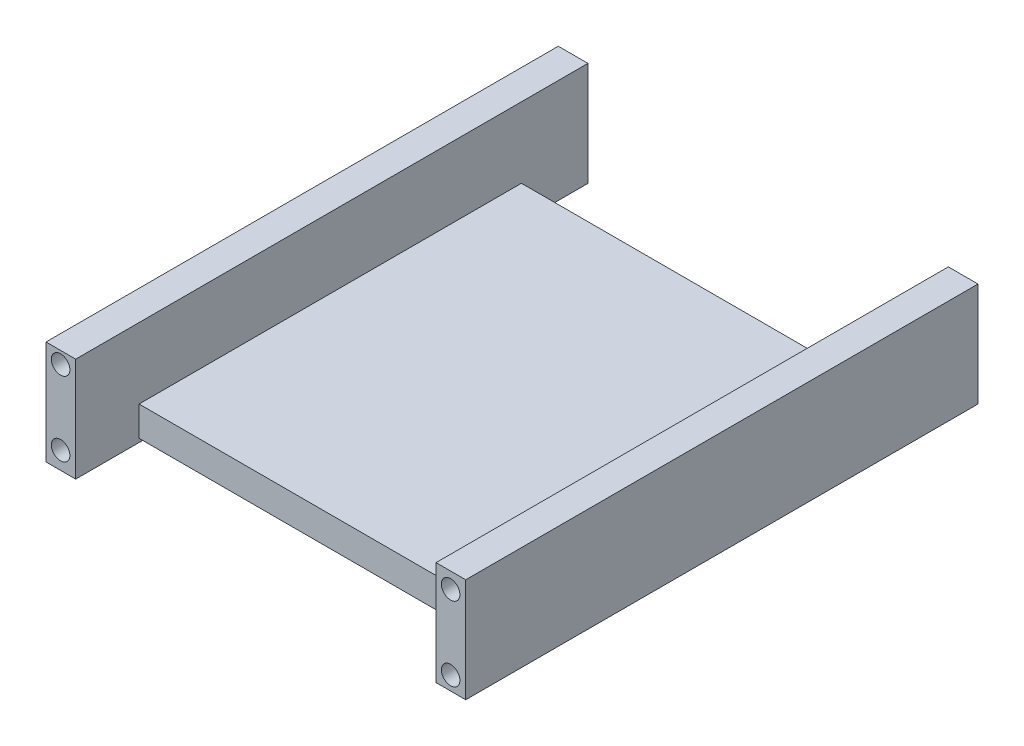
ISO-10303-21;
HEADER;
FILE_DESCRIPTION(('STEP AP214'),'2;1');
FILE_NAME('part.step','',(''),(''),'','','');
FILE_SCHEMA(('AUTOMOTIVE_DESIGN { 1 0 10303 214 1 1 1 1 }'));
ENDSEC;
DATA;
#1=APPLICATION_CONTEXT('core data for automotive mechanical design processes');
#2=APPLICATION_PROTOCOL_DEFINITION('international standard','automotive_design',2000,#1);
#3=PRODUCT_CONTEXT('',#1,'mechanical');
#4=PRODUCT('Part','Part','',(#3));
#5=PRODUCT_RELATED_PRODUCT_CATEGORY('part','',(#4));
#6=PRODUCT_DEFINITION_FORMATION('','',#4);
#7=PRODUCT_DEFINITION_CONTEXT('part definition',#1,'design');
#8=PRODUCT_DEFINITION('design','',#6,#7);
#9=PRODUCT_DEFINITION_SHAPE('','',#8);
#10=(LENGTH_UNIT() NAMED_UNIT(*) SI_UNIT(.MILLI.,.METRE.));
#11=(NAMED_UNIT(*) PLANE_ANGLE_UNIT() SI_UNIT($,.RADIAN.));
#12=(NAMED_UNIT(*) SI_UNIT($,.STERADIAN.) SOLID_ANGLE_UNIT());
#13=UNCERTAINTY_MEASURE_WITH_UNIT(LENGTH_MEASURE(1.E-05),#10,'distance_accuracy_value','');
#14=(GEOMETRIC_REPRESENTATION_CONTEXT(3) GLOBAL_UNCERTAINTY_ASSIGNED_CONTEXT((#13)) GLOBAL_UNIT_ASSIGNED_CONTEXT((#10,
#11,#12)) REPRESENTATION_CONTEXT('',''));
#15=CARTESIAN_POINT('',(0.,0.,0.));
#16=DIRECTION('',(0.,0.,1.));
#17=DIRECTION('',(1.,0.,0.));
#18=AXIS2_PLACEMENT_3D('',#15,#16,#17);
#19=CARTESIAN_POINT('',(0.,0.,0.));
#20=DIRECTION('',(1.,0.,0.));
#21=DIRECTION('',(0.,0.,-1.));
#22=AXIS2_PLACEMENT_3D('',#19,#20,#21);
#23=PLANE('',#22);
#24=DIRECTION('',(0.,-1.,0.));
#25=VECTOR('',#24,1.);
#26=CARTESIAN_POINT('',(0.,-6.,-51.));
#27=LINE('',#26,#25);
#28=CARTESIAN_POINT('',(0.,-6.,-51.));
#29=VERTEX_POINT('',#28);
#30=CARTESIAN_POINT('',(0.,-14.,-51.));
#31=VERTEX_POINT('',#30);
#32=EDGE_CURVE('E51',#29,#31,#27,.T.);
#33=ORIENTED_EDGE('',*,*,#32,.F.);
#34=DIRECTION('',(0.,0.,-1.));
#35=VECTOR('',#34,1.);
#36=CARTESIAN_POINT('',(0.,-6.,-51.));
#37=LINE('',#36,#35);
#38=CARTESIAN_POINT('',(0.,-6.,52.));
#39=VERTEX_POINT('',#38);
#40=EDGE_CURVE('E160',#39,#29,#37,.T.);
#41=ORIENTED_EDGE('',*,*,#40,.F.);
#42=DIRECTION('',(0.,1.,0.));
#43=VECTOR('',#42,1.);
#44=CARTESIAN_POINT('',(0.,-6.,52.));
#45=LINE('',#44,#43);
#46=CARTESIAN_POINT('',(0.,-14.,52.));
#47=VERTEX_POINT('',#46);
#48=EDGE_CURVE('E150',#47,#39,#45,.T.);
#49=ORIENTED_EDGE('',*,*,#48,.F.);
#50=DIRECTION('',(0.,0.,-1.));
#51=VECTOR('',#50,1.);
#52=CARTESIAN_POINT('',(0.,-14.,69.));
#53=LINE('',#52,#51);
#54=CARTESIAN_POINT('',(0.,-14.,69.));
#55=VERTEX_POINT('',#54);
#56=EDGE_CURVE('E289',#55,#47,#53,.T.);
#57=ORIENTED_EDGE('',*,*,#56,.F.);
#58=DIRECTION('',(0.,-1.,0.));
#59=VECTOR('',#58,1.);
#60=CARTESIAN_POINT('',(0.,14.,69.));
#61=LINE('',#60,#59);
#62=CARTESIAN_POINT('',(0.,14.,69.));
#63=VERTEX_POINT('',#62);
#64=EDGE_CURVE('E278',#63,#55,#61,.T.);
#65=ORIENTED_EDGE('',*,*,#64,.F.);
#66=DIRECTION('',(0.,0.,1.));
#67=VECTOR('',#66,1.);
#68=CARTESIAN_POINT('',(0.,14.,69.));
#69=LINE('',#68,#67);
#70=CARTESIAN_POINT('',(0.,14.,-69.));
#71=VERTEX_POINT('',#70);
#72=EDGE_CURVE('E272',#71,#63,#69,.T.);
#73=ORIENTED_EDGE('',*,*,#72,.F.);
#74=DIRECTION('',(0.,1.,0.));
#75=VECTOR('',#74,1.);
#76=CARTESIAN_POINT('',(0.,14.,-69.));
#77=LINE('',#76,#75);
#78=CARTESIAN_POINT('',(0.,-14.,-69.));
#79=VERTEX_POINT('',#78);
#80=EDGE_CURVE('E279',#79,#71,#77,.T.);
#81=ORIENTED_EDGE('',*,*,#80,.F.);
#82=EDGE_CURVE('E56',#31,#79,#53,.T.);
#83=ORIENTED_EDGE('',*,*,#82,.F.);
#84=EDGE_LOOP('',(#33,#41,#49,#57,#65,#73,#81,#83));
#85=FACE_BOUND('',#84,.T.);
#86=ADVANCED_FACE('F34',(#85),#23,.F.);
#87=CARTESIAN_POINT('',(8.,14.,-69.));
#88=DIRECTION('',(0.,0.,1.));
#89=DIRECTION('',(1.,0.,0.));
#90=AXIS2_PLACEMENT_3D('',#87,#88,#89);
#91=PLANE('',#90);
#92=CARTESIAN_POINT('',(3.99999999999979,-10.,-69.));
#93=DIRECTION('',(0.,0.,-1.));
#94=DIRECTION('',(-1.,0.,0.));
#95=AXIS2_PLACEMENT_3D('',#92,#93,#94);
#96=CIRCLE('',#95,2.5);
#97=CARTESIAN_POINT('',(1.49999999999979,-10.,-69.));
#98=VERTEX_POINT('',#97);
#99=EDGE_CURVE('E417',#98,#98,#96,.T.);
#100=ORIENTED_EDGE('',*,*,#99,.F.);
#101=EDGE_LOOP('',(#100));
#102=FACE_BOUND('',#101,.T.);
#103=CARTESIAN_POINT('',(4.,10.,-69.));
#104=DIRECTION('',(0.,0.,-1.));
#105=DIRECTION('',(-1.,0.,0.));
#106=AXIS2_PLACEMENT_3D('',#103,#104,#105);
#107=CIRCLE('',#106,2.5);
#108=CARTESIAN_POINT('',(1.5,10.,-69.));
#109=VERTEX_POINT('',#108);
#110=EDGE_CURVE('E187',#109,#109,#107,.T.);
#111=ORIENTED_EDGE('',*,*,#110,.F.);
#112=EDGE_LOOP('',(#111));
#113=FACE_BOUND('',#112,.T.);
#114=ORIENTED_EDGE('',*,*,#80,.T.);
#115=DIRECTION('',(-1.,0.,0.));
#116=VECTOR('',#115,1.);
#117=CARTESIAN_POINT('',(8.,14.,-69.));
#118=LINE('',#117,#116);
#119=CARTESIAN_POINT('',(8.,14.,-69.));
#120=VERTEX_POINT('',#119);
#121=EDGE_CURVE('E11',#120,#71,#118,.T.);
#122=ORIENTED_EDGE('',*,*,#121,.F.);
#123=DIRECTION('',(0.,1.,0.));
#124=VECTOR('',#123,1.);
#125=CARTESIAN_POINT('',(8.,14.,-69.));
#126=LINE('',#125,#124);
#127=CARTESIAN_POINT('',(8.,-14.,-69.));
#128=VERTEX_POINT('',#127);
#129=EDGE_CURVE('E301',#128,#120,#126,.T.);
#130=ORIENTED_EDGE('',*,*,#129,.F.);
#131=DIRECTION('',(-1.,0.,0.));
#132=VECTOR('',#131,1.);
#133=CARTESIAN_POINT('',(8.,-14.,-69.));
#134=LINE('',#133,#132);
#135=EDGE_CURVE('E296',#128,#79,#134,.T.);
#136=ORIENTED_EDGE('',*,*,#135,.T.);
#137=EDGE_LOOP('',(#114,#122,#130,#136));
#138=FACE_BOUND('',#137,.T.);
#139=ADVANCED_FACE('F36',(#102,#113,#138),#91,.F.);
#140=CARTESIAN_POINT('',(8.,14.,69.));
#141=DIRECTION('',(0.,-1.,0.));
#142=DIRECTION('',(0.,0.,-1.));
#143=AXIS2_PLACEMENT_3D('',#140,#141,#142);
#144=PLANE('',#143);
#145=ORIENTED_EDGE('',*,*,#72,.T.);
#146=DIRECTION('',(-1.,0.,0.));
#147=VECTOR('',#146,1.);
#148=CARTESIAN_POINT('',(8.,14.,69.));
#149=LINE('',#148,#147);
#150=CARTESIAN_POINT('',(8.,14.,69.));
#151=VERTEX_POINT('',#150);
#152=EDGE_CURVE('E43',#151,#63,#149,.T.);
#153=ORIENTED_EDGE('',*,*,#152,.F.);
#154=DIRECTION('',(0.,0.,1.));
#155=VECTOR('',#154,1.);
#156=CARTESIAN_POINT('',(8.,14.,69.));
#157=LINE('',#156,#155);
#158=EDGE_CURVE('E311',#120,#151,#157,.T.);
#159=ORIENTED_EDGE('',*,*,#158,.F.);
#160=ORIENTED_EDGE('',*,*,#121,.T.);
#161=EDGE_LOOP('',(#145,#153,#159,#160));
#162=FACE_BOUND('',#161,.T.);
#163=ADVANCED_FACE('F254',(#162),#144,.F.);
#164=CARTESIAN_POINT('',(8.,14.,69.));
#165=DIRECTION('',(0.,0.,-1.));
#166=DIRECTION('',(-1.,0.,0.));
#167=AXIS2_PLACEMENT_3D('',#164,#165,#166);
#168=PLANE('',#167);
#169=CARTESIAN_POINT('',(3.92665059054297,-10.2686019216343,69.));
#170=DIRECTION('',(0.,0.,-1.));
#171=DIRECTION('',(-1.,0.,0.));
#172=AXIS2_PLACEMENT_3D('',#169,#170,#171);
#173=CIRCLE('',#172,2.50000000000001);
#174=CARTESIAN_POINT('',(1.42665059054296,-10.2686019216343,69.));
#175=VERTEX_POINT('',#174);
#176=EDGE_CURVE('E182',#175,#175,#173,.T.);
#177=ORIENTED_EDGE('',*,*,#176,.T.);
#178=EDGE_LOOP('',(#177));
#179=FACE_BOUND('',#178,.T.);
#180=CARTESIAN_POINT('',(3.92665059054276,9.73139807836575,69.));
#181=DIRECTION('',(0.,0.,-1.));
#182=DIRECTION('',(-1.,0.,0.));
#183=AXIS2_PLACEMENT_3D('',#180,#181,#182);
#184=CIRCLE('',#183,2.50000000000001);
#185=CARTESIAN_POINT('',(1.42665059054275,9.73139807836575,69.));
#186=VERTEX_POINT('',#185);
#187=EDGE_CURVE('E177',#186,#186,#184,.T.);
#188=ORIENTED_EDGE('',*,*,#187,.T.);
#189=EDGE_LOOP('',(#188));
#190=FACE_BOUND('',#189,.T.);
#191=ORIENTED_EDGE('',*,*,#64,.T.);
#192=DIRECTION('',(-1.,0.,0.));
#193=VECTOR('',#192,1.);
#194=CARTESIAN_POINT('',(8.,-14.,69.));
#195=LINE('',#194,#193);
#196=CARTESIAN_POINT('',(8.,-14.,69.));
#197=VERTEX_POINT('',#196);
#198=EDGE_CURVE('E285',#197,#55,#195,.T.);
#199=ORIENTED_EDGE('',*,*,#198,.F.);
#200=DIRECTION('',(0.,-1.,0.));
#201=VECTOR('',#200,1.);
#202=CARTESIAN_POINT('',(8.,14.,69.));
#203=LINE('',#202,#201);
#204=EDGE_CURVE('E284',#151,#197,#203,.T.);
#205=ORIENTED_EDGE('',*,*,#204,.F.);
#206=ORIENTED_EDGE('',*,*,#152,.T.);
#207=EDGE_LOOP('',(#191,#199,#205,#206));
#208=FACE_BOUND('',#207,.T.);
#209=ADVANCED_FACE('F263',(#179,#190,#208),#168,.F.);
#210=CARTESIAN_POINT('',(8.,-14.,69.));
#211=DIRECTION('',(0.,1.,0.));
#212=DIRECTION('',(0.,0.,1.));
#213=AXIS2_PLACEMENT_3D('',#210,#211,#212);
#214=PLANE('',#213);
#215=ORIENTED_EDGE('',*,*,#56,.T.);
#216=DIRECTION('',(1.,0.,0.));
#217=VECTOR('',#216,1.);
#218=CARTESIAN_POINT('',(-97.,-14.,52.));
#219=LINE('',#218,#217);
#220=CARTESIAN_POINT('',(-97.,-14.,52.));
#221=VERTEX_POINT('',#220);
#222=EDGE_CURVE('E315',#221,#47,#219,.T.);
#223=ORIENTED_EDGE('',*,*,#222,.F.);
#224=DIRECTION('',(0.,0.,1.));
#225=VECTOR('',#224,1.);
#226=CARTESIAN_POINT('',(-97.,-14.,-51.));
#227=LINE('',#226,#225);
#228=CARTESIAN_POINT('',(-97.,-14.,-51.));
#229=VERTEX_POINT('',#228);
#230=EDGE_CURVE('E159',#229,#221,#227,.T.);
#231=ORIENTED_EDGE('',*,*,#230,.F.);
#232=DIRECTION('',(1.,0.,0.));
#233=VECTOR('',#232,1.);
#234=CARTESIAN_POINT('',(-97.,-14.,-51.));
#235=LINE('',#234,#233);
#236=EDGE_CURVE('E314',#229,#31,#235,.T.);
#237=ORIENTED_EDGE('',*,*,#236,.T.);
#238=ORIENTED_EDGE('',*,*,#82,.T.);
#239=ORIENTED_EDGE('',*,*,#135,.F.);
#240=DIRECTION('',(0.,0.,-1.));
#241=VECTOR('',#240,1.);
#242=CARTESIAN_POINT('',(8.,-14.,69.));
#243=LINE('',#242,#241);
#244=EDGE_CURVE('E304',#197,#128,#243,.T.);
#245=ORIENTED_EDGE('',*,*,#244,.F.);
#246=ORIENTED_EDGE('',*,*,#198,.T.);
#247=EDGE_LOOP('',(#215,#223,#231,#237,#238,#239,#245,#246));
#248=FACE_BOUND('',#247,.T.);
#249=ADVANCED_FACE('F260',(#248),#214,.F.);
#250=CARTESIAN_POINT('',(8.,0.,0.));
#251=DIRECTION('',(1.,0.,0.));
#252=DIRECTION('',(0.,0.,-1.));
#253=AXIS2_PLACEMENT_3D('',#250,#251,#252);
#254=PLANE('',#253);
#255=ORIENTED_EDGE('',*,*,#129,.T.);
#256=ORIENTED_EDGE('',*,*,#158,.T.);
#257=ORIENTED_EDGE('',*,*,#204,.T.);
#258=ORIENTED_EDGE('',*,*,#244,.T.);
#259=EDGE_LOOP('',(#255,#256,#257,#258));
#260=FACE_BOUND('',#259,.T.);
#261=ADVANCED_FACE('F258',(#260),#254,.T.);
#262=CARTESIAN_POINT('',(-97.,-6.,-51.));
#263=DIRECTION('',(0.,0.,1.));
#264=DIRECTION('',(1.,0.,0.));
#265=AXIS2_PLACEMENT_3D('',#262,#263,#264);
#266=PLANE('',#265);
#267=ORIENTED_EDGE('',*,*,#32,.T.);
#268=ORIENTED_EDGE('',*,*,#236,.F.);
#269=DIRECTION('',(0.,-1.,0.));
#270=VECTOR('',#269,1.);
#271=CARTESIAN_POINT('',(-97.,-6.,-51.));
#272=LINE('',#271,#270);
#273=CARTESIAN_POINT('',(-97.,-6.,-51.));
#274=VERTEX_POINT('',#273);
#275=EDGE_CURVE('E156',#274,#229,#272,.T.);
#276=ORIENTED_EDGE('',*,*,#275,.F.);
#277=DIRECTION('',(1.,0.,0.));
#278=VECTOR('',#277,1.);
#279=CARTESIAN_POINT('',(-97.,-6.,-51.));
#280=LINE('',#279,#278);
#281=EDGE_CURVE('E169',#274,#29,#280,.T.);
#282=ORIENTED_EDGE('',*,*,#281,.T.);
#283=EDGE_LOOP('',(#267,#268,#276,#282));
#284=FACE_BOUND('',#283,.T.);
#285=ADVANCED_FACE('F333',(#284),#266,.F.);
#286=CARTESIAN_POINT('',(-97.,-6.,52.));
#287=DIRECTION('',(0.,0.,-1.));
#288=DIRECTION('',(-1.,0.,0.));
#289=AXIS2_PLACEMENT_3D('',#286,#287,#288);
#290=PLANE('',#289);
#291=ORIENTED_EDGE('',*,*,#48,.T.);
#292=DIRECTION('',(1.,0.,0.));
#293=VECTOR('',#292,1.);
#294=CARTESIAN_POINT('',(-97.,-6.,52.));
#295=LINE('',#294,#293);
#296=CARTESIAN_POINT('',(-97.,-6.,52.));
#297=VERTEX_POINT('',#296);
#298=EDGE_CURVE('E318',#297,#39,#295,.T.);
#299=ORIENTED_EDGE('',*,*,#298,.F.);
#300=DIRECTION('',(0.,1.,0.));
#301=VECTOR('',#300,1.);
#302=CARTESIAN_POINT('',(-97.,-6.,52.));
#303=LINE('',#302,#301);
#304=EDGE_CURVE('E163',#221,#297,#303,.T.);
#305=ORIENTED_EDGE('',*,*,#304,.F.);
#306=ORIENTED_EDGE('',*,*,#222,.T.);
#307=EDGE_LOOP('',(#291,#299,#305,#306));
#308=FACE_BOUND('',#307,.T.);
#309=ADVANCED_FACE('F337',(#308),#290,.F.);
#310=CARTESIAN_POINT('',(-97.,-6.,-51.));
#311=DIRECTION('',(0.,-1.,0.));
#312=DIRECTION('',(0.,0.,-1.));
#313=AXIS2_PLACEMENT_3D('',#310,#311,#312);
#314=PLANE('',#313);
#315=ORIENTED_EDGE('',*,*,#40,.T.);
#316=ORIENTED_EDGE('',*,*,#281,.F.);
#317=DIRECTION('',(0.,0.,-1.));
#318=VECTOR('',#317,1.);
#319=CARTESIAN_POINT('',(-97.,-6.,-51.));
#320=LINE('',#319,#318);
#321=EDGE_CURVE('E166',#297,#274,#320,.T.);
#322=ORIENTED_EDGE('',*,*,#321,.F.);
#323=ORIENTED_EDGE('',*,*,#298,.T.);
#324=EDGE_LOOP('',(#315,#316,#322,#323));
#325=FACE_BOUND('',#324,.T.);
#326=ADVANCED_FACE('F330',(#325),#314,.F.);
#327=CARTESIAN_POINT('',(-97.,0.,0.));
#328=DIRECTION('',(-1.,0.,0.));
#329=DIRECTION('',(0.,0.,1.));
#330=AXIS2_PLACEMENT_3D('',#327,#328,#329);
#331=PLANE('',#330);
#332=DIRECTION('',(0.,1.,0.));
#333=VECTOR('',#332,1.);
#334=CARTESIAN_POINT('',(-97.,-14.9896789252528,69.0701834633502));
#335=LINE('',#334,#333);
#336=CARTESIAN_POINT('',(-97.,-14.9896789252528,69.0701834633502));
#337=VERTEX_POINT('',#336);
#338=CARTESIAN_POINT('',(-97.,13.0103210747472,69.0701834633502));
#339=VERTEX_POINT('',#338);
#340=EDGE_CURVE('E148',#337,#339,#335,.T.);
#341=ORIENTED_EDGE('',*,*,#340,.F.);
#342=DIRECTION('',(0.,0.,1.));
#343=VECTOR('',#342,1.);
#344=CARTESIAN_POINT('',(-97.,-14.9896789252528,69.0701834633502));
#345=LINE('',#344,#343);
#346=CARTESIAN_POINT('',(-97.,-14.9896789252528,-68.9298165366498));
#347=VERTEX_POINT('',#346);
#348=EDGE_CURVE('E144',#347,#337,#345,.T.);
#349=ORIENTED_EDGE('',*,*,#348,.F.);
#350=DIRECTION('',(0.,-1.,0.));
#351=VECTOR('',#350,1.);
#352=CARTESIAN_POINT('',(-97.,-14.9896789252528,-68.9298165366498));
#353=LINE('',#352,#351);
#354=CARTESIAN_POINT('',(-97.,13.0103210747472,-68.9298165366498));
#355=VERTEX_POINT('',#354);
#356=EDGE_CURVE('E226',#355,#347,#353,.T.);
#357=ORIENTED_EDGE('',*,*,#356,.F.);
#358=DIRECTION('',(0.,0.,-1.));
#359=VECTOR('',#358,1.);
#360=CARTESIAN_POINT('',(-97.,13.0103210747472,69.0701834633502));
#361=LINE('',#360,#359);
#362=EDGE_CURVE('E224',#339,#355,#361,.T.);
#363=ORIENTED_EDGE('',*,*,#362,.F.);
#364=EDGE_LOOP('',(#341,#349,#357,#363));
#365=FACE_BOUND('',#364,.T.);
#366=ORIENTED_EDGE('',*,*,#275,.T.);
#367=ORIENTED_EDGE('',*,*,#230,.T.);
#368=ORIENTED_EDGE('',*,*,#304,.T.);
#369=ORIENTED_EDGE('',*,*,#321,.T.);
#370=EDGE_LOOP('',(#366,#367,#368,#369));
#371=FACE_BOUND('',#370,.T.);
#372=ADVANCED_FACE('F237',(#365,#371),#331,.F.);
#373=CARTESIAN_POINT('',(-105.,-14.9896789252528,69.0701834633502));
#374=DIRECTION('',(0.,0.,-1.));
#375=DIRECTION('',(-1.,0.,0.));
#376=AXIS2_PLACEMENT_3D('',#373,#374,#375);
#377=PLANE('',#376);
#378=CARTESIAN_POINT('',(-101.073349409457,-10.2686019216343,69.0701834633502));
#379=DIRECTION('',(0.,0.,1.));
#380=DIRECTION('',(1.,0.,0.));
#381=AXIS2_PLACEMENT_3D('',#378,#379,#380);
#382=CIRCLE('',#381,2.50000000000001);
#383=CARTESIAN_POINT('',(-98.573349409457,-10.2686019216343,69.0701834633502));
#384=VERTEX_POINT('',#383);
#385=EDGE_CURVE('E204',#384,#384,#382,.T.);
#386=ORIENTED_EDGE('',*,*,#385,.F.);
#387=EDGE_LOOP('',(#386));
#388=FACE_BOUND('',#387,.T.);
#389=CARTESIAN_POINT('',(-101.073349409457,9.73139807836575,69.0701834633502));
#390=DIRECTION('',(0.,0.,1.));
#391=DIRECTION('',(1.,0.,0.));
#392=AXIS2_PLACEMENT_3D('',#389,#390,#391);
#393=CIRCLE('',#392,2.50000000000001);
#394=CARTESIAN_POINT('',(-98.5733494094572,9.73139807836575,69.0701834633502));
#395=VERTEX_POINT('',#394);
#396=EDGE_CURVE('E180',#395,#395,#393,.T.);
#397=ORIENTED_EDGE('',*,*,#396,.F.);
#398=EDGE_LOOP('',(#397));
#399=FACE_BOUND('',#398,.T.);
#400=ORIENTED_EDGE('',*,*,#340,.T.);
#401=DIRECTION('',(1.,0.,0.));
#402=VECTOR('',#401,1.);
#403=CARTESIAN_POINT('',(-105.,13.0103210747472,69.0701834633502));
#404=LINE('',#403,#402);
#405=CARTESIAN_POINT('',(-105.,13.0103210747472,69.0701834633502));
#406=VERTEX_POINT('',#405);
#407=EDGE_CURVE('E128',#406,#339,#404,.T.);
#408=ORIENTED_EDGE('',*,*,#407,.F.);
#409=DIRECTION('',(0.,1.,0.));
#410=VECTOR('',#409,1.);
#411=CARTESIAN_POINT('',(-105.,-14.9896789252528,69.0701834633502));
#412=LINE('',#411,#410);
#413=CARTESIAN_POINT('',(-105.,-14.9896789252528,69.0701834633502));
#414=VERTEX_POINT('',#413);
#415=EDGE_CURVE('E135',#414,#406,#412,.T.);
#416=ORIENTED_EDGE('',*,*,#415,.F.);
#417=DIRECTION('',(1.,0.,0.));
#418=VECTOR('',#417,1.);
#419=CARTESIAN_POINT('',(-105.,-14.9896789252528,69.0701834633502));
#420=LINE('',#419,#418);
#421=EDGE_CURVE('E222',#414,#337,#420,.T.);
#422=ORIENTED_EDGE('',*,*,#421,.T.);
#423=EDGE_LOOP('',(#400,#408,#416,#422));
#424=FACE_BOUND('',#423,.T.);
#425=ADVANCED_FACE('F146',(#388,#399,#424),#377,.F.);
#426=CARTESIAN_POINT('',(-105.,13.0103210747472,69.0701834633502));
#427=DIRECTION('',(0.,-1.,0.));
#428=DIRECTION('',(0.,0.,-1.));
#429=AXIS2_PLACEMENT_3D('',#426,#427,#428);
#430=PLANE('',#429);
#431=ORIENTED_EDGE('',*,*,#362,.T.);
#432=DIRECTION('',(1.,0.,0.));
#433=VECTOR('',#432,1.);
#434=CARTESIAN_POINT('',(-105.,13.0103210747472,-68.9298165366498));
#435=LINE('',#434,#433);
#436=CARTESIAN_POINT('',(-105.,13.0103210747472,-68.9298165366498));
#437=VERTEX_POINT('',#436);
#438=EDGE_CURVE('E131',#437,#355,#435,.T.);
#439=ORIENTED_EDGE('',*,*,#438,.F.);
#440=DIRECTION('',(0.,0.,-1.));
#441=VECTOR('',#440,1.);
#442=CARTESIAN_POINT('',(-105.,13.0103210747472,69.0701834633502));
#443=LINE('',#442,#441);
#444=EDGE_CURVE('E124',#406,#437,#443,.T.);
#445=ORIENTED_EDGE('',*,*,#444,.F.);
#446=ORIENTED_EDGE('',*,*,#407,.T.);
#447=EDGE_LOOP('',(#431,#439,#445,#446));
#448=FACE_BOUND('',#447,.T.);
#449=ADVANCED_FACE('F126',(#448),#430,.F.);
#450=CARTESIAN_POINT('',(-105.,-14.9896789252528,-68.9298165366498));
#451=DIRECTION('',(0.,0.,1.));
#452=DIRECTION('',(1.,0.,0.));
#453=AXIS2_PLACEMENT_3D('',#450,#451,#452);
#454=PLANE('',#453);
#455=CARTESIAN_POINT('',(-101.,-10.,-68.9298165366498));
#456=DIRECTION('',(0.,0.,1.));
#457=DIRECTION('',(1.,0.,0.));
#458=AXIS2_PLACEMENT_3D('',#455,#456,#457);
#459=CIRCLE('',#458,2.49999999999999);
#460=CARTESIAN_POINT('',(-98.5000000000002,-10.,-68.9298165366498));
#461=VERTEX_POINT('',#460);
#462=EDGE_CURVE('E38',#461,#461,#459,.T.);
#463=ORIENTED_EDGE('',*,*,#462,.T.);
#464=EDGE_LOOP('',(#463));
#465=FACE_BOUND('',#464,.T.);
#466=CARTESIAN_POINT('',(-101.,10.,-68.9298165366498));
#467=DIRECTION('',(0.,0.,1.));
#468=DIRECTION('',(1.,0.,0.));
#469=AXIS2_PLACEMENT_3D('',#466,#467,#468);
#470=CIRCLE('',#469,2.49999999999999);
#471=CARTESIAN_POINT('',(-98.5,10.,-68.9298165366498));
#472=VERTEX_POINT('',#471);
#473=EDGE_CURVE('E185',#472,#472,#470,.T.);
#474=ORIENTED_EDGE('',*,*,#473,.T.);
#475=EDGE_LOOP('',(#474));
#476=FACE_BOUND('',#475,.T.);
#477=ORIENTED_EDGE('',*,*,#356,.T.);
#478=DIRECTION('',(1.,0.,0.));
#479=VECTOR('',#478,1.);
#480=CARTESIAN_POINT('',(-105.,-14.9896789252528,-68.9298165366498));
#481=LINE('',#480,#479);
#482=CARTESIAN_POINT('',(-105.,-14.9896789252528,-68.9298165366498));
#483=VERTEX_POINT('',#482);
#484=EDGE_CURVE('E152',#483,#347,#481,.T.);
#485=ORIENTED_EDGE('',*,*,#484,.F.);
#486=DIRECTION('',(0.,-1.,0.));
#487=VECTOR('',#486,1.);
#488=CARTESIAN_POINT('',(-105.,-14.9896789252528,-68.9298165366498));
#489=LINE('',#488,#487);
#490=EDGE_CURVE('E134',#437,#483,#489,.T.);
#491=ORIENTED_EDGE('',*,*,#490,.F.);
#492=ORIENTED_EDGE('',*,*,#438,.T.);
#493=EDGE_LOOP('',(#477,#485,#491,#492));
#494=FACE_BOUND('',#493,.T.);
#495=ADVANCED_FACE('F239',(#465,#476,#494),#454,.F.);
#496=CARTESIAN_POINT('',(-105.,-14.9896789252528,69.0701834633502));
#497=DIRECTION('',(0.,1.,0.));
#498=DIRECTION('',(0.,0.,1.));
#499=AXIS2_PLACEMENT_3D('',#496,#497,#498);
#500=PLANE('',#499);
#501=ORIENTED_EDGE('',*,*,#348,.T.);
#502=ORIENTED_EDGE('',*,*,#421,.F.);
#503=DIRECTION('',(0.,0.,1.));
#504=VECTOR('',#503,1.);
#505=CARTESIAN_POINT('',(-105.,-14.9896789252528,69.0701834633502));
#506=LINE('',#505,#504);
#507=EDGE_CURVE('E140',#483,#414,#506,.T.);
#508=ORIENTED_EDGE('',*,*,#507,.F.);
#509=ORIENTED_EDGE('',*,*,#484,.T.);
#510=EDGE_LOOP('',(#501,#502,#508,#509));
#511=FACE_BOUND('',#510,.T.);
#512=ADVANCED_FACE('F233',(#511),#500,.F.);
#513=CARTESIAN_POINT('',(-105.,0.,0.));
#514=DIRECTION('',(-1.,0.,0.));
#515=DIRECTION('',(0.,0.,1.));
#516=AXIS2_PLACEMENT_3D('',#513,#514,#515);
#517=PLANE('',#516);
#518=ORIENTED_EDGE('',*,*,#415,.T.);
#519=ORIENTED_EDGE('',*,*,#444,.T.);
#520=ORIENTED_EDGE('',*,*,#490,.T.);
#521=ORIENTED_EDGE('',*,*,#507,.T.);
#522=EDGE_LOOP('',(#518,#519,#520,#521));
#523=FACE_BOUND('',#522,.T.);
#524=ADVANCED_FACE('F138',(#523),#517,.T.);
#525=CARTESIAN_POINT('',(-101.073349409457,9.73139807836575,64.0701834633502));
#526=DIRECTION('',(0.,0.,1.));
#527=DIRECTION('',(1.,0.,0.));
#528=AXIS2_PLACEMENT_3D('',#525,#526,#527);
#529=CYLINDRICAL_SURFACE('',#528,2.50000000000001);
#530=CARTESIAN_POINT('',(-101.073349409457,9.73139807836575,64.0701834633502));
#531=DIRECTION('',(0.,0.,1.));
#532=DIRECTION('',(1.,0.,0.));
#533=AXIS2_PLACEMENT_3D('',#530,#531,#532);
#534=CIRCLE('',#533,2.50000000000001);
#535=CARTESIAN_POINT('',(-98.5733494094572,9.73139807836575,64.0701834633502));
#536=VERTEX_POINT('',#535);
#537=EDGE_CURVE('E215',#536,#536,#534,.T.);
#538=ORIENTED_EDGE('',*,*,#537,.F.);
#539=EDGE_LOOP('',(#538));
#540=FACE_BOUND('',#539,.T.);
#541=ORIENTED_EDGE('',*,*,#396,.T.);
#542=EDGE_LOOP('',(#541));
#543=FACE_BOUND('',#542,.T.);
#544=ADVANCED_FACE('F350',(#540,#543),#529,.F.);
#545=CARTESIAN_POINT('',(-101.073349409457,9.73139807836575,64.0701834633502));
#546=DIRECTION('',(0.,0.,1.));
#547=DIRECTION('',(1.,0.,0.));
#548=AXIS2_PLACEMENT_3D('',#545,#546,#547);
#549=PLANE('',#548);
#550=ORIENTED_EDGE('',*,*,#537,.T.);
#551=EDGE_LOOP('',(#550));
#552=FACE_BOUND('',#551,.T.);
#553=ADVANCED_FACE('F353',(#552),#549,.T.);
#554=CARTESIAN_POINT('',(3.92665059054276,9.73139807836575,64.0701834633502));
#555=DIRECTION('',(0.,0.,1.));
#556=DIRECTION('',(1.,0.,0.));
#557=AXIS2_PLACEMENT_3D('',#554,#555,#556);
#558=CYLINDRICAL_SURFACE('',#557,2.50000000000001);
#559=CARTESIAN_POINT('',(3.92665059054276,9.73139807836575,64.0701834633502));
#560=DIRECTION('',(0.,0.,1.));
#561=DIRECTION('',(1.,0.,0.));
#562=AXIS2_PLACEMENT_3D('',#559,#560,#561);
#563=CIRCLE('',#562,2.50000000000001);
#564=CARTESIAN_POINT('',(6.42665059054277,9.73139807836575,64.0701834633502));
#565=VERTEX_POINT('',#564);
#566=EDGE_CURVE('E181',#565,#565,#563,.T.);
#567=ORIENTED_EDGE('',*,*,#566,.F.);
#568=EDGE_LOOP('',(#567));
#569=FACE_BOUND('',#568,.T.);
#570=ORIENTED_EDGE('',*,*,#187,.F.);
#571=EDGE_LOOP('',(#570));
#572=FACE_BOUND('',#571,.T.);
#573=ADVANCED_FACE('F357',(#569,#572),#558,.F.);
#574=CARTESIAN_POINT('',(3.92665059054276,9.73139807836575,64.0701834633502));
#575=DIRECTION('',(0.,0.,1.));
#576=DIRECTION('',(1.,0.,0.));
#577=AXIS2_PLACEMENT_3D('',#574,#575,#576);
#578=PLANE('',#577);
#579=ORIENTED_EDGE('',*,*,#566,.T.);
#580=EDGE_LOOP('',(#579));
#581=FACE_BOUND('',#580,.T.);
#582=ADVANCED_FACE('F361',(#581),#578,.T.);
#583=CARTESIAN_POINT('',(3.92665059054297,-10.2686019216343,64.0701834633502));
#584=DIRECTION('',(0.,0.,1.));
#585=DIRECTION('',(1.,0.,0.));
#586=AXIS2_PLACEMENT_3D('',#583,#584,#585);
#587=CYLINDRICAL_SURFACE('',#586,2.50000000000001);
#588=CARTESIAN_POINT('',(3.92665059054297,-10.2686019216343,64.0701834633502));
#589=DIRECTION('',(0.,0.,1.));
#590=DIRECTION('',(1.,0.,0.));
#591=AXIS2_PLACEMENT_3D('',#588,#589,#590);
#592=CIRCLE('',#591,2.50000000000001);
#593=CARTESIAN_POINT('',(6.42665059054297,-10.2686019216343,64.0701834633502));
#594=VERTEX_POINT('',#593);
#595=EDGE_CURVE('E184',#594,#594,#592,.T.);
#596=ORIENTED_EDGE('',*,*,#595,.F.);
#597=EDGE_LOOP('',(#596));
#598=FACE_BOUND('',#597,.T.);
#599=ORIENTED_EDGE('',*,*,#176,.F.);
#600=EDGE_LOOP('',(#599));
#601=FACE_BOUND('',#600,.T.);
#602=ADVANCED_FACE('F365',(#598,#601),#587,.F.);
#603=CARTESIAN_POINT('',(3.92665059054297,-10.2686019216343,64.0701834633502));
#604=DIRECTION('',(0.,0.,1.));
#605=DIRECTION('',(1.,0.,0.));
#606=AXIS2_PLACEMENT_3D('',#603,#604,#605);
#607=PLANE('',#606);
#608=ORIENTED_EDGE('',*,*,#595,.T.);
#609=EDGE_LOOP('',(#608));
#610=FACE_BOUND('',#609,.T.);
#611=ADVANCED_FACE('F369',(#610),#607,.T.);
#612=CARTESIAN_POINT('',(-101.073349409457,-10.2686019216343,64.0701834633502));
#613=DIRECTION('',(0.,0.,1.));
#614=DIRECTION('',(1.,0.,0.));
#615=AXIS2_PLACEMENT_3D('',#612,#613,#614);
#616=CYLINDRICAL_SURFACE('',#615,2.50000000000001);
#617=CARTESIAN_POINT('',(-101.073349409457,-10.2686019216343,64.0701834633502));
#618=DIRECTION('',(0.,0.,1.));
#619=DIRECTION('',(1.,0.,0.));
#620=AXIS2_PLACEMENT_3D('',#617,#618,#619);
#621=CIRCLE('',#620,2.50000000000001);
#622=CARTESIAN_POINT('',(-98.573349409457,-10.2686019216343,64.0701834633502));
#623=VERTEX_POINT('',#622);
#624=EDGE_CURVE('E206',#623,#623,#621,.T.);
#625=ORIENTED_EDGE('',*,*,#624,.F.);
#626=EDGE_LOOP('',(#625));
#627=FACE_BOUND('',#626,.T.);
#628=ORIENTED_EDGE('',*,*,#385,.T.);
#629=EDGE_LOOP('',(#628));
#630=FACE_BOUND('',#629,.T.);
#631=ADVANCED_FACE('F373',(#627,#630),#616,.F.);
#632=CARTESIAN_POINT('',(-101.073349409457,-10.2686019216343,64.0701834633502));
#633=DIRECTION('',(0.,0.,1.));
#634=DIRECTION('',(1.,0.,0.));
#635=AXIS2_PLACEMENT_3D('',#632,#633,#634);
#636=PLANE('',#635);
#637=ORIENTED_EDGE('',*,*,#624,.T.);
#638=EDGE_LOOP('',(#637));
#639=FACE_BOUND('',#638,.T.);
#640=ADVANCED_FACE('F377',(#639),#636,.T.);
#641=CARTESIAN_POINT('',(4.,10.,-64.));
#642=DIRECTION('',(0.,0.,-1.));
#643=DIRECTION('',(-1.,0.,0.));
#644=AXIS2_PLACEMENT_3D('',#641,#642,#643);
#645=CYLINDRICAL_SURFACE('',#644,2.5);
#646=CARTESIAN_POINT('',(4.,10.,-64.));
#647=DIRECTION('',(0.,0.,-1.));
#648=DIRECTION('',(-1.,0.,0.));
#649=AXIS2_PLACEMENT_3D('',#646,#647,#648);
#650=CIRCLE('',#649,2.5);
#651=CARTESIAN_POINT('',(1.5,10.,-64.));
#652=VERTEX_POINT('',#651);
#653=EDGE_CURVE('E192',#652,#652,#650,.T.);
#654=ORIENTED_EDGE('',*,*,#653,.F.);
#655=EDGE_LOOP('',(#654));
#656=FACE_BOUND('',#655,.T.);
#657=ORIENTED_EDGE('',*,*,#110,.T.);
#658=EDGE_LOOP('',(#657));
#659=FACE_BOUND('',#658,.T.);
#660=ADVANCED_FACE('F381',(#656,#659),#645,.F.);
#661=CARTESIAN_POINT('',(4.,10.,-64.));
#662=DIRECTION('',(0.,0.,-1.));
#663=DIRECTION('',(-1.,0.,0.));
#664=AXIS2_PLACEMENT_3D('',#661,#662,#663);
#665=PLANE('',#664);
#666=ORIENTED_EDGE('',*,*,#653,.T.);
#667=EDGE_LOOP('',(#666));
#668=FACE_BOUND('',#667,.T.);
#669=ADVANCED_FACE('F385',(#668),#665,.T.);
#670=CARTESIAN_POINT('',(-101.,10.,-64.));
#671=DIRECTION('',(0.,0.,-1.));
#672=DIRECTION('',(-1.,0.,0.));
#673=AXIS2_PLACEMENT_3D('',#670,#671,#672);
#674=CYLINDRICAL_SURFACE('',#673,2.49999999999999);
#675=CARTESIAN_POINT('',(-101.,10.,-64.));
#676=DIRECTION('',(0.,0.,-1.));
#677=DIRECTION('',(-1.,0.,0.));
#678=AXIS2_PLACEMENT_3D('',#675,#676,#677);
#679=CIRCLE('',#678,2.49999999999999);
#680=CARTESIAN_POINT('',(-103.5,10.,-64.));
#681=VERTEX_POINT('',#680);
#682=EDGE_CURVE('E188',#681,#681,#679,.T.);
#683=ORIENTED_EDGE('',*,*,#682,.F.);
#684=EDGE_LOOP('',(#683));
#685=FACE_BOUND('',#684,.T.);
#686=ORIENTED_EDGE('',*,*,#473,.F.);
#687=EDGE_LOOP('',(#686));
#688=FACE_BOUND('',#687,.T.);
#689=ADVANCED_FACE('F389',(#685,#688),#674,.F.);
#690=CARTESIAN_POINT('',(-101.,10.,-64.));
#691=DIRECTION('',(0.,0.,-1.));
#692=DIRECTION('',(-1.,0.,0.));
#693=AXIS2_PLACEMENT_3D('',#690,#691,#692);
#694=PLANE('',#693);
#695=ORIENTED_EDGE('',*,*,#682,.T.);
#696=EDGE_LOOP('',(#695));
#697=FACE_BOUND('',#696,.T.);
#698=ADVANCED_FACE('F393',(#697),#694,.T.);
#699=CARTESIAN_POINT('',(-101.,-10.,-64.));
#700=DIRECTION('',(0.,0.,-1.));
#701=DIRECTION('',(-1.,0.,0.));
#702=AXIS2_PLACEMENT_3D('',#699,#700,#701);
#703=CYLINDRICAL_SURFACE('',#702,2.49999999999999);
#704=CARTESIAN_POINT('',(-101.,-10.,-64.));
#705=DIRECTION('',(0.,0.,-1.));
#706=DIRECTION('',(-1.,0.,0.));
#707=AXIS2_PLACEMENT_3D('',#704,#705,#706);
#708=CIRCLE('',#707,2.49999999999999);
#709=CARTESIAN_POINT('',(-103.5,-10.,-64.));
#710=VERTEX_POINT('',#709);
#711=EDGE_CURVE('E199',#710,#710,#708,.T.);
#712=ORIENTED_EDGE('',*,*,#711,.F.);
#713=EDGE_LOOP('',(#712));
#714=FACE_BOUND('',#713,.T.);
#715=ORIENTED_EDGE('',*,*,#462,.F.);
#716=EDGE_LOOP('',(#715));
#717=FACE_BOUND('',#716,.T.);
#718=ADVANCED_FACE('F397',(#714,#717),#703,.F.);
#719=CARTESIAN_POINT('',(-101.,-10.,-64.));
#720=DIRECTION('',(0.,0.,-1.));
#721=DIRECTION('',(-1.,0.,0.));
#722=AXIS2_PLACEMENT_3D('',#719,#720,#721);
#723=PLANE('',#722);
#724=ORIENTED_EDGE('',*,*,#711,.T.);
#725=EDGE_LOOP('',(#724));
#726=FACE_BOUND('',#725,.T.);
#727=ADVANCED_FACE('F400',(#726),#723,.T.);
#728=CARTESIAN_POINT('',(3.99999999999979,-10.,-64.));
#729=DIRECTION('',(0.,0.,-1.));
#730=DIRECTION('',(-1.,0.,0.));
#731=AXIS2_PLACEMENT_3D('',#728,#729,#730);
#732=CYLINDRICAL_SURFACE('',#731,2.5);
#733=CARTESIAN_POINT('',(3.99999999999979,-10.,-64.));
#734=DIRECTION('',(0.,0.,-1.));
#735=DIRECTION('',(-1.,0.,0.));
#736=AXIS2_PLACEMENT_3D('',#733,#734,#735);
#737=CIRCLE('',#736,2.5);
#738=CARTESIAN_POINT('',(1.49999999999979,-10.,-64.));
#739=VERTEX_POINT('',#738);
#740=EDGE_CURVE('E416',#739,#739,#737,.T.);
#741=ORIENTED_EDGE('',*,*,#740,.F.);
#742=EDGE_LOOP('',(#741));
#743=FACE_BOUND('',#742,.T.);
#744=ORIENTED_EDGE('',*,*,#99,.T.);
#745=EDGE_LOOP('',(#744));
#746=FACE_BOUND('',#745,.T.);
#747=ADVANCED_FACE('F404',(#743,#746),#732,.F.);
#748=CARTESIAN_POINT('',(3.99999999999979,-10.,-64.));
#749=DIRECTION('',(0.,0.,-1.));
#750=DIRECTION('',(-1.,0.,0.));
#751=AXIS2_PLACEMENT_3D('',#748,#749,#750);
#752=PLANE('',#751);
#753=ORIENTED_EDGE('',*,*,#740,.T.);
#754=EDGE_LOOP('',(#753));
#755=FACE_BOUND('',#754,.T.);
#756=ADVANCED_FACE('F408',(#755),#752,.T.);
#757=CLOSED_SHELL('',(#86,#139,#163,#209,#249,#261,#285,#309,#326,#372,#425,#449,#495,#512,#524,
#544,#553,#573,#582,#602,#611,#631,#640,#660,#669,#689,#698,#718,#727,#747,#756));
#758=MANIFOLD_SOLID_BREP('B2',#757);
#759=ADVANCED_BREP_SHAPE_REPRESENTATION('',(#18,#758),#14);
#760=SHAPE_DEFINITION_REPRESENTATION(#9,#759);
ENDSEC;
END-ISO-10303-21;
